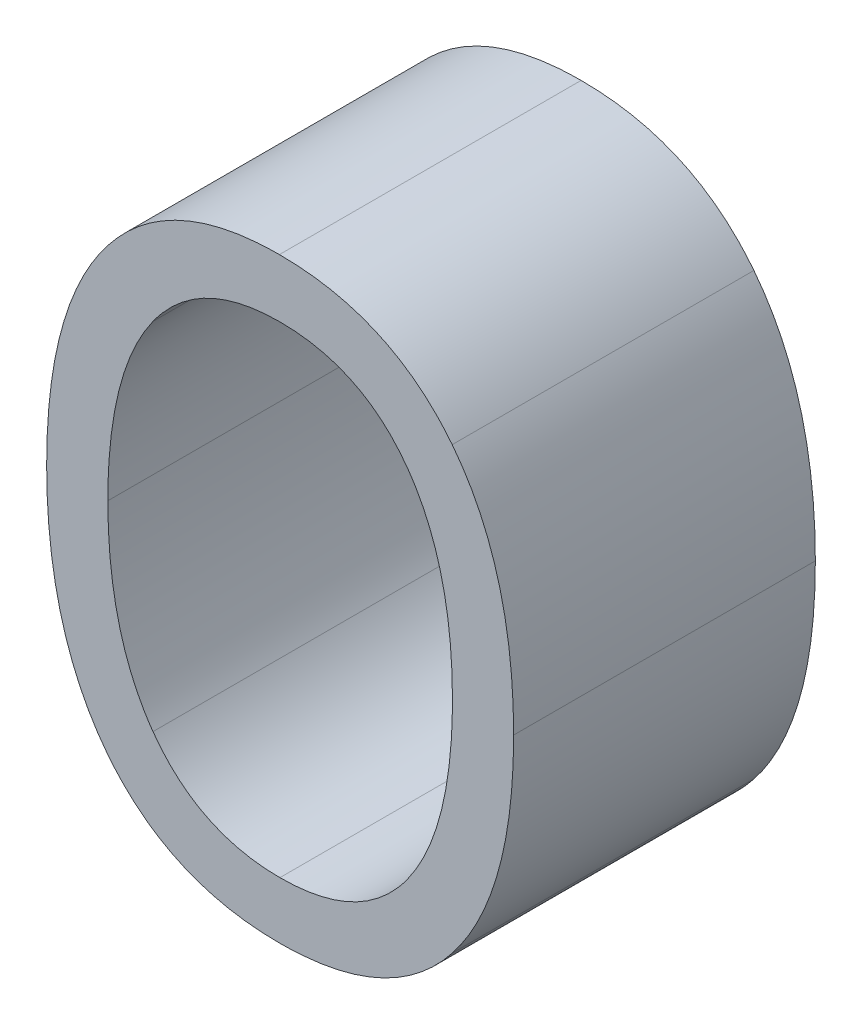
ISO-10303-21;
HEADER;
FILE_DESCRIPTION(('STEP AP214'),'2;1');
FILE_NAME('part.step','',(''),(''),'','','');
FILE_SCHEMA(('AUTOMOTIVE_DESIGN { 1 0 10303 214 1 1 1 1 }'));
ENDSEC;
DATA;
#1=APPLICATION_CONTEXT('core data for automotive mechanical design processes');
#2=APPLICATION_PROTOCOL_DEFINITION('international standard','automotive_design',2000,#1);
#3=PRODUCT_CONTEXT('',#1,'mechanical');
#4=PRODUCT('Part','Part','',(#3));
#5=PRODUCT_RELATED_PRODUCT_CATEGORY('part','',(#4));
#6=PRODUCT_DEFINITION_FORMATION('','',#4);
#7=PRODUCT_DEFINITION_CONTEXT('part definition',#1,'design');
#8=PRODUCT_DEFINITION('design','',#6,#7);
#9=PRODUCT_DEFINITION_SHAPE('','',#8);
#10=(LENGTH_UNIT() NAMED_UNIT(*) SI_UNIT(.MILLI.,.METRE.));
#11=(NAMED_UNIT(*) PLANE_ANGLE_UNIT() SI_UNIT($,.RADIAN.));
#12=(NAMED_UNIT(*) SI_UNIT($,.STERADIAN.) SOLID_ANGLE_UNIT());
#13=UNCERTAINTY_MEASURE_WITH_UNIT(LENGTH_MEASURE(1.E-05),#10,'distance_accuracy_value','');
#14=(GEOMETRIC_REPRESENTATION_CONTEXT(3) GLOBAL_UNCERTAINTY_ASSIGNED_CONTEXT((#13)) GLOBAL_UNIT_ASSIGNED_CONTEXT((#10,
#11,#12)) REPRESENTATION_CONTEXT('',''));
#15=CARTESIAN_POINT('',(0.,0.,0.));
#16=DIRECTION('',(0.,0.,1.));
#17=DIRECTION('',(1.,0.,0.));
#18=AXIS2_PLACEMENT_3D('',#15,#16,#17);
#19=CARTESIAN_POINT('',(21.952691691412,-5.202102016968,19.1980552485228));
#20=CARTESIAN_POINT('',(21.952691691412,-5.202102016968,20.2019447514772));
#21=CARTESIAN_POINT('',(21.952691691412,-5.454750172523,19.1980552485228));
#22=CARTESIAN_POINT('',(21.952691691412,-5.454750172523,20.2019447514772));
#23=CARTESIAN_POINT('',(22.002534958079,-5.650612394746,19.1980552485228));
#24=CARTESIAN_POINT('',(22.002534958079,-5.650612394746,20.2019447514772));
#25=CARTESIAN_POINT('',(22.102342846968,-5.789956794746,19.1980552485228));
#26=CARTESIAN_POINT('',(22.102342846968,-5.789956794746,20.2019447514772));
#27=(BOUNDED_SURFACE() B_SPLINE_SURFACE(3,1,((#19,#20),(#21,#22),(#23,#24),(#25,#26)),
.UNSPECIFIED.,.F.,.F.,.F.) B_SPLINE_SURFACE_WITH_KNOTS((4,4),(2,2),(0.,1.),(-1.00194475147721,
0.00194475147721345),
.UNSPECIFIED.) GEOMETRIC_REPRESENTATION_ITEM() RATIONAL_B_SPLINE_SURFACE(((1.,1.),(1.,1.),(1.,
1.),(1.,1.))) REPRESENTATION_ITEM('') SURFACE());
#28=DIRECTION('',(0.,0.,-1.));
#29=VECTOR('',#28,1.);
#30=CARTESIAN_POINT('',(21.952691691412,-5.202102016968,20.2));
#31=LINE('',#30,#29);
#32=CARTESIAN_POINT('',(21.952691691412,-5.202102016968,20.2));
#33=VERTEX_POINT('',#32);
#34=CARTESIAN_POINT('',(21.952691691412,-5.202102016968,19.2));
#35=VERTEX_POINT('',#34);
#36=EDGE_CURVE('E154',#33,#35,#31,.T.);
#37=CARTESIAN_POINT('',(21.952691691412,-5.202102016968,20.2));
#38=CARTESIAN_POINT('',(21.952691691412,-5.454750172523,20.2));
#39=CARTESIAN_POINT('',(22.002534958079,-5.650612394746,20.2));
#40=CARTESIAN_POINT('',(22.102342846968,-5.789956794746,20.2));
#41=(BOUNDED_CURVE() B_SPLINE_CURVE(3,(#37,#38,#39,#40),.UNSPECIFIED.,.F.,
.F.) B_SPLINE_CURVE_WITH_KNOTS((4,4),(0.,1.),
.UNSPECIFIED.) CURVE() GEOMETRIC_REPRESENTATION_ITEM() RATIONAL_B_SPLINE_CURVE((1.,1.,1.,1.)) REPRESENTATION_ITEM(''));
#42=CARTESIAN_POINT('',(22.102342846968,-5.789956794746,20.2));
#43=VERTEX_POINT('',#42);
#44=EDGE_CURVE('E151',#33,#43,#41,.T.);
#45=DIRECTION('',(0.,0.,-1.));
#46=VECTOR('',#45,1.);
#47=CARTESIAN_POINT('',(22.102342846968,-5.789956794746,20.2));
#48=LINE('',#47,#46);
#49=CARTESIAN_POINT('',(22.102342846968,-5.789956794746,19.2));
#50=VERTEX_POINT('',#49);
#51=EDGE_CURVE('E11',#43,#50,#48,.T.);
#52=CARTESIAN_POINT('',(21.952691691412,-5.202102016968,19.2));
#53=CARTESIAN_POINT('',(21.952691691412,-5.454750172523,19.2));
#54=CARTESIAN_POINT('',(22.002534958079,-5.650612394746,19.2));
#55=CARTESIAN_POINT('',(22.102342846968,-5.789956794746,19.2));
#56=(BOUNDED_CURVE() B_SPLINE_CURVE(3,(#52,#53,#54,#55),.UNSPECIFIED.,.F.,
.F.) B_SPLINE_CURVE_WITH_KNOTS((4,4),(0.,1.),
.UNSPECIFIED.) CURVE() GEOMETRIC_REPRESENTATION_ITEM() RATIONAL_B_SPLINE_CURVE((1.,1.,1.,1.)) REPRESENTATION_ITEM(''));
#57=EDGE_CURVE('E216',#35,#50,#56,.T.);
#58=ORIENTED_EDGE('',*,*,#36,.F.);
#59=ORIENTED_EDGE('',*,*,#44,.T.);
#60=ORIENTED_EDGE('',*,*,#51,.T.);
#61=ORIENTED_EDGE('',*,*,#57,.F.);
#62=EDGE_LOOP('',(#58,#59,#60,#61));
#63=FACE_BOUND('',#62,.T.);
#64=ADVANCED_FACE('F16',(#63),#27,.F.);
#65=CARTESIAN_POINT('',(22.102342846968,-5.789956794746,19.1978705750779));
#66=CARTESIAN_POINT('',(22.102342846968,-5.789956794746,20.2021294249221));
#67=CARTESIAN_POINT('',(22.202164846968,-5.929315305857,19.1978705750779));
#68=CARTESIAN_POINT('',(22.202164846968,-5.929315305857,20.2021294249221));
#69=CARTESIAN_POINT('',(22.342409535857,-5.998829461412,19.1978705750779));
#70=CARTESIAN_POINT('',(22.342409535857,-5.998829461412,20.2021294249221));
#71=CARTESIAN_POINT('',(22.522955558079,-5.998829461412,19.1978705750779));
#72=CARTESIAN_POINT('',(22.522955558079,-5.998829461412,20.2021294249221));
#73=(BOUNDED_SURFACE() B_SPLINE_SURFACE(3,1,((#65,#66),(#67,#68),(#69,#70),(#71,#72)),
.UNSPECIFIED.,.F.,.F.,.F.) B_SPLINE_SURFACE_WITH_KNOTS((4,4),(2,2),(0.,1.),(-1.00212942492215,
0.00212942492214646),
.UNSPECIFIED.) GEOMETRIC_REPRESENTATION_ITEM() RATIONAL_B_SPLINE_SURFACE(((1.,1.),(1.,1.),(1.,
1.),(1.,1.))) REPRESENTATION_ITEM('') SURFACE());
#74=CARTESIAN_POINT('',(22.102342846968,-5.789956794746,20.2));
#75=CARTESIAN_POINT('',(22.202164846968,-5.929315305857,20.2));
#76=CARTESIAN_POINT('',(22.342409535857,-5.998829461412,20.2));
#77=CARTESIAN_POINT('',(22.522955558079,-5.998829461412,20.2));
#78=(BOUNDED_CURVE() B_SPLINE_CURVE(3,(#74,#75,#76,#77),.UNSPECIFIED.,.F.,
.F.) B_SPLINE_CURVE_WITH_KNOTS((4,4),(0.,1.),
.UNSPECIFIED.) CURVE() GEOMETRIC_REPRESENTATION_ITEM() RATIONAL_B_SPLINE_CURVE((1.,1.,1.,1.)) REPRESENTATION_ITEM(''));
#79=CARTESIAN_POINT('',(22.522955558079,-5.998829461412,20.2));
#80=VERTEX_POINT('',#79);
#81=EDGE_CURVE('E142',#43,#80,#78,.T.);
#82=DIRECTION('',(0.,0.,-1.));
#83=VECTOR('',#82,1.);
#84=CARTESIAN_POINT('',(22.522955558079,-5.998829461412,20.2));
#85=LINE('',#84,#83);
#86=CARTESIAN_POINT('',(22.522955558079,-5.998829461412,19.2));
#87=VERTEX_POINT('',#86);
#88=EDGE_CURVE('E29',#80,#87,#85,.T.);
#89=CARTESIAN_POINT('',(22.102342846968,-5.789956794746,19.2));
#90=CARTESIAN_POINT('',(22.202164846968,-5.929315305857,19.2));
#91=CARTESIAN_POINT('',(22.342409535857,-5.998829461412,19.2));
#92=CARTESIAN_POINT('',(22.522955558079,-5.998829461412,19.2));
#93=(BOUNDED_CURVE() B_SPLINE_CURVE(3,(#89,#90,#91,#92),.UNSPECIFIED.,.F.,
.F.) B_SPLINE_CURVE_WITH_KNOTS((4,4),(0.,1.),
.UNSPECIFIED.) CURVE() GEOMETRIC_REPRESENTATION_ITEM() RATIONAL_B_SPLINE_CURVE((1.,1.,1.,1.)) REPRESENTATION_ITEM(''));
#94=EDGE_CURVE('E145',#50,#87,#93,.T.);
#95=ORIENTED_EDGE('',*,*,#51,.F.);
#96=ORIENTED_EDGE('',*,*,#81,.T.);
#97=ORIENTED_EDGE('',*,*,#88,.T.);
#98=ORIENTED_EDGE('',*,*,#94,.F.);
#99=EDGE_LOOP('',(#95,#96,#97,#98));
#100=FACE_BOUND('',#99,.T.);
#101=ADVANCED_FACE('F140',(#100),#73,.F.);
#102=CARTESIAN_POINT('',(22.522955558079,-5.998829461412,19.1978766403374));
#103=CARTESIAN_POINT('',(22.522955558079,-5.998829461412,20.2021233596626));
#104=CARTESIAN_POINT('',(22.705618246968,-5.998829461412,19.1978766403374));
#105=CARTESIAN_POINT('',(22.705618246968,-5.998829461412,20.2021233596626));
#106=CARTESIAN_POINT('',(22.846653158079,-5.929907972523,19.1978766403374));
#107=CARTESIAN_POINT('',(22.846653158079,-5.929907972523,20.2021233596626));
#108=CARTESIAN_POINT('',(22.945944580301,-5.791743261412,19.1978766403374));
#109=CARTESIAN_POINT('',(22.945944580301,-5.791743261412,20.2021233596626));
#110=(BOUNDED_SURFACE() B_SPLINE_SURFACE(3,1,((#102,#103),(#104,#105),(#106,#107),(#108,#109)),
.UNSPECIFIED.,.F.,.F.,.F.) B_SPLINE_SURFACE_WITH_KNOTS((4,4),(2,2),(0.,1.),(-1.00212335966262,
0.00212335966262119),
.UNSPECIFIED.) GEOMETRIC_REPRESENTATION_ITEM() RATIONAL_B_SPLINE_SURFACE(((1.,1.),(1.,1.),(1.,
1.),(1.,1.))) REPRESENTATION_ITEM('') SURFACE());
#111=CARTESIAN_POINT('',(22.522955558079,-5.998829461412,20.2));
#112=CARTESIAN_POINT('',(22.705618246968,-5.998829461412,20.2));
#113=CARTESIAN_POINT('',(22.846653158079,-5.929907972523,20.2));
#114=CARTESIAN_POINT('',(22.945944580301,-5.791743261412,20.2));
#115=(BOUNDED_CURVE() B_SPLINE_CURVE(3,(#111,#112,#113,#114),.UNSPECIFIED.,.F.,
.F.) B_SPLINE_CURVE_WITH_KNOTS((4,4),(0.,1.),
.UNSPECIFIED.) CURVE() GEOMETRIC_REPRESENTATION_ITEM() RATIONAL_B_SPLINE_CURVE((1.,1.,1.,1.)) REPRESENTATION_ITEM(''));
#116=CARTESIAN_POINT('',(22.945944580301,-5.791743261412,20.2));
#117=VERTEX_POINT('',#116);
#118=EDGE_CURVE('E165',#80,#117,#115,.T.);
#119=DIRECTION('',(0.,0.,-1.));
#120=VECTOR('',#119,1.);
#121=CARTESIAN_POINT('',(22.945944580301,-5.791743261412,20.2));
#122=LINE('',#121,#120);
#123=CARTESIAN_POINT('',(22.945944580301,-5.791743261412,19.2));
#124=VERTEX_POINT('',#123);
#125=EDGE_CURVE('E194',#117,#124,#122,.T.);
#126=CARTESIAN_POINT('',(22.522955558079,-5.998829461412,19.2));
#127=CARTESIAN_POINT('',(22.705618246968,-5.998829461412,19.2));
#128=CARTESIAN_POINT('',(22.846653158079,-5.929907972523,19.2));
#129=CARTESIAN_POINT('',(22.945944580301,-5.791743261412,19.2));
#130=(BOUNDED_CURVE() B_SPLINE_CURVE(3,(#126,#127,#128,#129),.UNSPECIFIED.,.F.,
.F.) B_SPLINE_CURVE_WITH_KNOTS((4,4),(0.,1.),
.UNSPECIFIED.) CURVE() GEOMETRIC_REPRESENTATION_ITEM() RATIONAL_B_SPLINE_CURVE((1.,1.,1.,1.)) REPRESENTATION_ITEM(''));
#131=EDGE_CURVE('E215',#87,#124,#130,.T.);
#132=ORIENTED_EDGE('',*,*,#88,.F.);
#133=ORIENTED_EDGE('',*,*,#118,.T.);
#134=ORIENTED_EDGE('',*,*,#125,.T.);
#135=ORIENTED_EDGE('',*,*,#131,.F.);
#136=EDGE_LOOP('',(#132,#133,#134,#135));
#137=FACE_BOUND('',#136,.T.);
#138=ADVANCED_FACE('F446',(#137),#110,.F.);
#139=CARTESIAN_POINT('',(22.945944580301,-5.791743261412,19.1980421734753));
#140=CARTESIAN_POINT('',(22.945944580301,-5.791743261412,20.2019578265248));
#141=CARTESIAN_POINT('',(23.045224713635,-5.653428972523,19.1980421734753));
#142=CARTESIAN_POINT('',(23.045224713635,-5.653428972523,20.2019578265248));
#143=CARTESIAN_POINT('',(23.094932513635,-5.457129305857,19.1980421734753));
#144=CARTESIAN_POINT('',(23.094932513635,-5.457129305857,20.2019578265248));
#145=CARTESIAN_POINT('',(23.094932513635,-5.202102016968,19.1980421734753));
#146=CARTESIAN_POINT('',(23.094932513635,-5.202102016968,20.2019578265248));
#147=(BOUNDED_SURFACE() B_SPLINE_SURFACE(3,1,((#139,#140),(#141,#142),(#143,#144),(#145,#146)),
.UNSPECIFIED.,.F.,.F.,.F.) B_SPLINE_SURFACE_WITH_KNOTS((4,4),(2,2),(0.,1.),(-1.00195782652476,
0.00195782652475572),
.UNSPECIFIED.) GEOMETRIC_REPRESENTATION_ITEM() RATIONAL_B_SPLINE_SURFACE(((1.,1.),(1.,1.),(1.,
1.),(1.,1.))) REPRESENTATION_ITEM('') SURFACE());
#148=CARTESIAN_POINT('',(22.945944580301,-5.791743261412,20.2));
#149=CARTESIAN_POINT('',(23.045224713635,-5.653428972523,20.2));
#150=CARTESIAN_POINT('',(23.094932513635,-5.457129305857,20.2));
#151=CARTESIAN_POINT('',(23.094932513635,-5.202102016968,20.2));
#152=(BOUNDED_CURVE() B_SPLINE_CURVE(3,(#148,#149,#150,#151),.UNSPECIFIED.,.F.,
.F.) B_SPLINE_CURVE_WITH_KNOTS((4,4),(0.,1.),
.UNSPECIFIED.) CURVE() GEOMETRIC_REPRESENTATION_ITEM() RATIONAL_B_SPLINE_CURVE((1.,1.,1.,1.)) REPRESENTATION_ITEM(''));
#153=CARTESIAN_POINT('',(23.094932513635,-5.202102016968,20.2));
#154=VERTEX_POINT('',#153);
#155=EDGE_CURVE('E172',#117,#154,#152,.T.);
#156=DIRECTION('',(0.,0.,-1.));
#157=VECTOR('',#156,1.);
#158=CARTESIAN_POINT('',(23.094932513635,-5.202102016968,20.2));
#159=LINE('',#158,#157);
#160=CARTESIAN_POINT('',(23.094932513635,-5.202102016968,19.2));
#161=VERTEX_POINT('',#160);
#162=EDGE_CURVE('E187',#154,#161,#159,.T.);
#163=CARTESIAN_POINT('',(22.945944580301,-5.791743261412,19.2));
#164=CARTESIAN_POINT('',(23.045224713635,-5.653428972523,19.2));
#165=CARTESIAN_POINT('',(23.094932513635,-5.457129305857,19.2));
#166=CARTESIAN_POINT('',(23.094932513635,-5.202102016968,19.2));
#167=(BOUNDED_CURVE() B_SPLINE_CURVE(3,(#163,#164,#165,#166),.UNSPECIFIED.,.F.,
.F.) B_SPLINE_CURVE_WITH_KNOTS((4,4),(0.,1.),
.UNSPECIFIED.) CURVE() GEOMETRIC_REPRESENTATION_ITEM() RATIONAL_B_SPLINE_CURVE((1.,1.,1.,1.)) REPRESENTATION_ITEM(''));
#168=EDGE_CURVE('E225',#124,#161,#167,.T.);
#169=ORIENTED_EDGE('',*,*,#125,.F.);
#170=ORIENTED_EDGE('',*,*,#155,.T.);
#171=ORIENTED_EDGE('',*,*,#162,.T.);
#172=ORIENTED_EDGE('',*,*,#168,.F.);
#173=EDGE_LOOP('',(#169,#170,#171,#172));
#174=FACE_BOUND('',#173,.T.);
#175=ADVANCED_FACE('F522',(#174),#147,.F.);
#176=CARTESIAN_POINT('',(23.094932513635,-5.202102016968,19.1980464113698));
#177=CARTESIAN_POINT('',(23.094932513635,-5.202102016968,20.2019535886302));
#178=CARTESIAN_POINT('',(23.094932513635,-4.94692232807888,19.1980464113698));
#179=CARTESIAN_POINT('',(23.094932513635,-4.94692232807888,20.2019535886302));
#180=CARTESIAN_POINT('',(23.045224713635,-4.750334794746,19.1980464113698));
#181=CARTESIAN_POINT('',(23.045224713635,-4.750334794746,20.2019535886302));
#182=CARTESIAN_POINT('',(22.945944580301,-4.611566128079,19.1980464113698));
#183=CARTESIAN_POINT('',(22.945944580301,-4.611566128079,20.2019535886302));
#184=(BOUNDED_SURFACE() B_SPLINE_SURFACE(3,1,((#176,#177),(#178,#179),(#180,#181),(#182,#183)),
.UNSPECIFIED.,.F.,.F.,.F.) B_SPLINE_SURFACE_WITH_KNOTS((4,4),(2,2),(0.,1.),(-1.00195358863022,
0.00195358863022238),
.UNSPECIFIED.) GEOMETRIC_REPRESENTATION_ITEM() RATIONAL_B_SPLINE_SURFACE(((1.,1.),(1.,1.),(1.,
1.),(1.,1.))) REPRESENTATION_ITEM('') SURFACE());
#185=CARTESIAN_POINT('',(23.094932513635,-5.202102016968,20.2));
#186=CARTESIAN_POINT('',(23.094932513635,-4.94692232807888,20.2));
#187=CARTESIAN_POINT('',(23.045224713635,-4.750334794746,20.2));
#188=CARTESIAN_POINT('',(22.945944580301,-4.611566128079,20.2));
#189=(BOUNDED_CURVE() B_SPLINE_CURVE(3,(#185,#186,#187,#188),.UNSPECIFIED.,.F.,
.F.) B_SPLINE_CURVE_WITH_KNOTS((4,4),(0.,1.),
.UNSPECIFIED.) CURVE() GEOMETRIC_REPRESENTATION_ITEM() RATIONAL_B_SPLINE_CURVE((1.,1.,1.,1.)) REPRESENTATION_ITEM(''));
#190=CARTESIAN_POINT('',(22.945944580301,-4.611566128079,20.2));
#191=VERTEX_POINT('',#190);
#192=EDGE_CURVE('E319',#154,#191,#189,.T.);
#193=DIRECTION('',(0.,0.,-1.));
#194=VECTOR('',#193,1.);
#195=CARTESIAN_POINT('',(22.945944580301,-4.611566128079,20.2));
#196=LINE('',#195,#194);
#197=CARTESIAN_POINT('',(22.945944580301,-4.611566128079,19.2));
#198=VERTEX_POINT('',#197);
#199=EDGE_CURVE('E182',#191,#198,#196,.T.);
#200=CARTESIAN_POINT('',(23.094932513635,-5.202102016968,19.2));
#201=CARTESIAN_POINT('',(23.094932513635,-4.94692232807888,19.2));
#202=CARTESIAN_POINT('',(23.045224713635,-4.750334794746,19.2));
#203=CARTESIAN_POINT('',(22.945944580301,-4.611566128079,19.2));
#204=(BOUNDED_CURVE() B_SPLINE_CURVE(3,(#200,#201,#202,#203),.UNSPECIFIED.,.F.,
.F.) B_SPLINE_CURVE_WITH_KNOTS((4,4),(0.,1.),
.UNSPECIFIED.) CURVE() GEOMETRIC_REPRESENTATION_ITEM() RATIONAL_B_SPLINE_CURVE((1.,1.,1.,1.)) REPRESENTATION_ITEM(''));
#205=EDGE_CURVE('E380',#161,#198,#204,.T.);
#206=ORIENTED_EDGE('',*,*,#162,.F.);
#207=ORIENTED_EDGE('',*,*,#192,.T.);
#208=ORIENTED_EDGE('',*,*,#199,.T.);
#209=ORIENTED_EDGE('',*,*,#205,.F.);
#210=EDGE_LOOP('',(#206,#207,#208,#209));
#211=FACE_BOUND('',#210,.T.);
#212=ADVANCED_FACE('F511',(#211),#184,.F.);
#213=CARTESIAN_POINT('',(22.9465827394822,-4.61245869891189,20.2));
#214=CARTESIAN_POINT('',(22.8839035348031,-4.52461865395366,20.2));
#215=CARTESIAN_POINT('',(22.7990220422254,-4.4736749415078,20.2));
#216=CARTESIAN_POINT('',(22.6815566715053,-4.4031752143402,20.2));
#217=CARTESIAN_POINT('',(22.5217760451913,-4.40343667145909,20.2));
#218=CARTESIAN_POINT('',(22.9465827394822,-4.61245869891189,19.2));
#219=CARTESIAN_POINT('',(22.8839035348031,-4.52461865395366,19.2));
#220=CARTESIAN_POINT('',(22.7990220422254,-4.4736749415078,19.2));
#221=CARTESIAN_POINT('',(22.6815566715053,-4.4031752143402,19.2));
#222=CARTESIAN_POINT('',(22.5217760451913,-4.40343667145909,19.2));
#223=(BOUNDED_SURFACE() B_SPLINE_SURFACE(1,2,((#213,#214,#215,#216,#217),(#218,#219,#220,#221,
#222)),.UNSPECIFIED.,.F.,.F.,.F.) B_SPLINE_SURFACE_WITH_KNOTS((2,2),(3,2,3),
(-0.0117003646997792,-2.47628151922325E-05),(535.149251645892,538.146587155737,
542.284160374719),
.UNSPECIFIED.) GEOMETRIC_REPRESENTATION_ITEM() RATIONAL_B_SPLINE_SURFACE(((0.987240048111929,
0.9934746460069,1.,0.990992289706126,0.982538630100533),(0.987240048111929,0.9934746460069,1.,
0.990992289706126,0.982538630100533))) REPRESENTATION_ITEM('') SURFACE());
#224=CARTESIAN_POINT('',(-21.2763687638257,-77.9112768646644,20.2));
#225=DIRECTION('',(0.,0.,1.));
#226=DIRECTION('',(-0.514605894124347,-0.857426832874083,0.));
#227=AXIS2_PLACEMENT_3D('',#224,#225,#226);
#228=ELLIPSE('',#227,85.6488263259726,6.24299917260388);
#229=CARTESIAN_POINT('',(22.522955558079,-4.403435705857,20.2));
#230=VERTEX_POINT('',#229);
#231=EDGE_CURVE('E313',#191,#230,#228,.T.);
#232=DIRECTION('',(0.,0.,-1.));
#233=VECTOR('',#232,1.);
#234=CARTESIAN_POINT('',(22.522955558079,-4.403435705857,20.2));
#235=LINE('',#234,#233);
#236=CARTESIAN_POINT('',(22.522955558079,-4.403435705857,19.2));
#237=VERTEX_POINT('',#236);
#238=EDGE_CURVE('E43',#230,#237,#235,.T.);
#239=CARTESIAN_POINT('',(-21.2763687638257,-77.9112768646644,19.2));
#240=DIRECTION('',(0.,0.,1.));
#241=DIRECTION('',(-0.514605894124347,-0.857426832874083,0.));
#242=AXIS2_PLACEMENT_3D('',#239,#240,#241);
#243=ELLIPSE('',#242,85.6488263259726,6.24299917260388);
#244=EDGE_CURVE('E297',#198,#237,#243,.T.);
#245=ORIENTED_EDGE('',*,*,#199,.F.);
#246=ORIENTED_EDGE('',*,*,#231,.T.);
#247=ORIENTED_EDGE('',*,*,#238,.T.);
#248=ORIENTED_EDGE('',*,*,#244,.F.);
#249=EDGE_LOOP('',(#245,#246,#247,#248));
#250=FACE_BOUND('',#249,.T.);
#251=ADVANCED_FACE('F521',(#250),#223,.F.);
#252=CARTESIAN_POINT('',(22.5241226656018,-4.40343667557879,20.2));
#253=CARTESIAN_POINT('',(22.3710446892245,-4.40318242368291,20.2));
#254=CARTESIAN_POINT('',(22.2565181387204,-4.46957286007691,20.2));
#255=CARTESIAN_POINT('',(22.1674042715406,-4.52123169817851,20.2));
#256=CARTESIAN_POINT('',(22.1017000339969,-4.6132064552561,20.2));
#257=CARTESIAN_POINT('',(22.5241226656018,-4.40343667557879,19.2));
#258=CARTESIAN_POINT('',(22.3710446892245,-4.40318242368291,19.2));
#259=CARTESIAN_POINT('',(22.2565181387204,-4.46957286007691,19.2));
#260=CARTESIAN_POINT('',(22.1674042715406,-4.52123169817851,19.2));
#261=CARTESIAN_POINT('',(22.1017000339969,-4.6132064552561,19.2));
#262=(BOUNDED_SURFACE() B_SPLINE_SURFACE(1,2,((#252,#253,#254,#255,#256),(#257,#258,#259,#260,
#261)),.UNSPECIFIED.,.F.,.F.,.F.) B_SPLINE_SURFACE_WITH_KNOTS((2,2),(3,2,3),
(-0.00698793288565868,-1.48468474499607E-05),(895.877339066315,901.062352128046,
905.102889443867),
.UNSPECIFIED.) GEOMETRIC_REPRESENTATION_ITEM() RATIONAL_B_SPLINE_SURFACE(((0.986827106736595,
0.993258379238003,1.,0.994746441342836,0.9896813464451),(0.986827106736595,0.993258379238003,1.,
0.994746441342836,0.9896813464451))) REPRESENTATION_ITEM('') SURFACE());
#263=CARTESIAN_POINT('',(94.1795515900217,-128.540103129819,20.2));
#264=DIRECTION('',(0.,0.,1.));
#265=DIRECTION('',(0.501520458691995,-0.865145785121427,0.));
#266=AXIS2_PLACEMENT_3D('',#263,#264,#265);
#267=ELLIPSE('',#266,143.409969047727,8.07869655368327);
#268=CARTESIAN_POINT('',(22.102342846968,-4.612308372523,20.2));
#269=VERTEX_POINT('',#268);
#270=EDGE_CURVE('E306',#230,#269,#267,.T.);
#271=DIRECTION('',(0.,0.,-1.));
#272=VECTOR('',#271,1.);
#273=CARTESIAN_POINT('',(22.102342846968,-4.612308372523,20.2));
#274=LINE('',#273,#272);
#275=CARTESIAN_POINT('',(22.102342846968,-4.612308372523,19.2));
#276=VERTEX_POINT('',#275);
#277=EDGE_CURVE('E22',#269,#276,#274,.T.);
#278=CARTESIAN_POINT('',(94.1795515900217,-128.540103129819,19.2));
#279=DIRECTION('',(0.,0.,1.));
#280=DIRECTION('',(0.501520458691995,-0.865145785121427,0.));
#281=AXIS2_PLACEMENT_3D('',#278,#279,#280);
#282=ELLIPSE('',#281,143.409969047727,8.07869655368327);
#283=EDGE_CURVE('E293',#237,#276,#282,.T.);
#284=ORIENTED_EDGE('',*,*,#238,.F.);
#285=ORIENTED_EDGE('',*,*,#270,.T.);
#286=ORIENTED_EDGE('',*,*,#277,.T.);
#287=ORIENTED_EDGE('',*,*,#283,.F.);
#288=EDGE_LOOP('',(#284,#285,#286,#287));
#289=FACE_BOUND('',#288,.T.);
#290=ADVANCED_FACE('F559',(#289),#262,.F.);
#291=CARTESIAN_POINT('',(22.102342846968,-4.612308372523,19.19805522249));
#292=CARTESIAN_POINT('',(22.102342846968,-4.612308372523,20.20194477751));
#293=CARTESIAN_POINT('',(22.002534958079,-4.751649950301,19.19805522249));
#294=CARTESIAN_POINT('',(22.002534958079,-4.751649950301,20.20194477751));
#295=CARTESIAN_POINT('',(21.952691691412,-4.94810201696777,19.19805522249));
#296=CARTESIAN_POINT('',(21.952691691412,-4.94810201696777,20.20194477751));
#297=CARTESIAN_POINT('',(21.952691691412,-5.202102016968,19.19805522249));
#298=CARTESIAN_POINT('',(21.952691691412,-5.202102016968,20.20194477751));
#299=(BOUNDED_SURFACE() B_SPLINE_SURFACE(3,1,((#291,#292),(#293,#294),(#295,#296),(#297,#298)),
.UNSPECIFIED.,.F.,.F.,.F.) B_SPLINE_SURFACE_WITH_KNOTS((4,4),(2,2),(0.,1.),(-1.00194477750995,
0.00194477750995188),
.UNSPECIFIED.) GEOMETRIC_REPRESENTATION_ITEM() RATIONAL_B_SPLINE_SURFACE(((1.,1.),(1.,1.),(1.,
1.),(1.,1.))) REPRESENTATION_ITEM('') SURFACE());
#300=CARTESIAN_POINT('',(22.102342846968,-4.612308372523,20.2));
#301=CARTESIAN_POINT('',(22.002534958079,-4.751649950301,20.2));
#302=CARTESIAN_POINT('',(21.952691691412,-4.94810201696777,20.2));
#303=CARTESIAN_POINT('',(21.952691691412,-5.202102016968,20.2));
#304=(BOUNDED_CURVE() B_SPLINE_CURVE(3,(#300,#301,#302,#303),.UNSPECIFIED.,.F.,
.F.) B_SPLINE_CURVE_WITH_KNOTS((4,4),(0.,1.),
.UNSPECIFIED.) CURVE() GEOMETRIC_REPRESENTATION_ITEM() RATIONAL_B_SPLINE_CURVE((1.,1.,1.,1.)) REPRESENTATION_ITEM(''));
#305=EDGE_CURVE('E301',#269,#33,#304,.T.);
#306=CARTESIAN_POINT('',(22.102342846968,-4.612308372523,19.2));
#307=CARTESIAN_POINT('',(22.002534958079,-4.751649950301,19.2));
#308=CARTESIAN_POINT('',(21.952691691412,-4.94810201696777,19.2));
#309=CARTESIAN_POINT('',(21.952691691412,-5.202102016968,19.2));
#310=(BOUNDED_CURVE() B_SPLINE_CURVE(3,(#306,#307,#308,#309),.UNSPECIFIED.,.F.,
.F.) B_SPLINE_CURVE_WITH_KNOTS((4,4),(0.,1.),
.UNSPECIFIED.) CURVE() GEOMETRIC_REPRESENTATION_ITEM() RATIONAL_B_SPLINE_CURVE((1.,1.,1.,1.)) REPRESENTATION_ITEM(''));
#311=EDGE_CURVE('E178',#276,#35,#310,.T.);
#312=ORIENTED_EDGE('',*,*,#277,.F.);
#313=ORIENTED_EDGE('',*,*,#305,.T.);
#314=ORIENTED_EDGE('',*,*,#36,.T.);
#315=ORIENTED_EDGE('',*,*,#311,.F.);
#316=EDGE_LOOP('',(#312,#313,#314,#315));
#317=FACE_BOUND('',#316,.T.);
#318=ADVANCED_FACE('F500',(#317),#299,.F.);
#319=CARTESIAN_POINT('',(23.297751513635,-5.202102016968,19.1984790838637));
#320=CARTESIAN_POINT('',(23.297751513635,-5.202102016968,20.2015209161362));
#321=CARTESIAN_POINT('',(23.297751513635,-5.51452483919,19.1984790838637));
#322=CARTESIAN_POINT('',(23.297751513635,-5.51452483919,20.2015209161362));
#323=CARTESIAN_POINT('',(23.230021002523,-5.756829550301,19.1984790838637));
#324=CARTESIAN_POINT('',(23.230021002523,-5.756829550301,20.2015209161362));
#325=CARTESIAN_POINT('',(23.094808335857,-5.929315305857,19.1984790838637));
#326=CARTESIAN_POINT('',(23.094808335857,-5.929315305857,20.2015209161362));
#327=(BOUNDED_SURFACE() B_SPLINE_SURFACE(3,1,((#319,#320),(#321,#322),(#323,#324),(#325,#326)),
.UNSPECIFIED.,.F.,.F.,.F.) B_SPLINE_SURFACE_WITH_KNOTS((4,4),(2,2),(0.,1.),(-1.00152091613627,
0.00152091613626967),
.UNSPECIFIED.) GEOMETRIC_REPRESENTATION_ITEM() RATIONAL_B_SPLINE_SURFACE(((1.,1.),(1.,1.),(1.,
1.),(1.,1.))) REPRESENTATION_ITEM('') SURFACE());
#328=DIRECTION('',(0.,0.,-1.));
#329=VECTOR('',#328,1.);
#330=CARTESIAN_POINT('',(23.297751513635,-5.202102016968,20.2));
#331=LINE('',#330,#329);
#332=CARTESIAN_POINT('',(23.297751513635,-5.202102016968,20.2));
#333=VERTEX_POINT('',#332);
#334=CARTESIAN_POINT('',(23.297751513635,-5.202102016968,19.2));
#335=VERTEX_POINT('',#334);
#336=EDGE_CURVE('E356',#333,#335,#331,.T.);
#337=CARTESIAN_POINT('',(23.297751513635,-5.202102016968,20.2));
#338=CARTESIAN_POINT('',(23.297751513635,-5.51452483919,20.2));
#339=CARTESIAN_POINT('',(23.230021002523,-5.756829550301,20.2));
#340=CARTESIAN_POINT('',(23.094808335857,-5.929315305857,20.2));
#341=(BOUNDED_CURVE() B_SPLINE_CURVE(3,(#337,#338,#339,#340),.UNSPECIFIED.,.F.,
.F.) B_SPLINE_CURVE_WITH_KNOTS((4,4),(0.,1.),
.UNSPECIFIED.) CURVE() GEOMETRIC_REPRESENTATION_ITEM() RATIONAL_B_SPLINE_CURVE((1.,1.,1.,1.)) REPRESENTATION_ITEM(''));
#342=CARTESIAN_POINT('',(23.094808335857,-5.929315305857,20.2));
#343=VERTEX_POINT('',#342);
#344=EDGE_CURVE('E350',#333,#343,#341,.T.);
#345=DIRECTION('',(0.,0.,-1.));
#346=VECTOR('',#345,1.);
#347=CARTESIAN_POINT('',(23.094808335857,-5.929315305857,20.2));
#348=LINE('',#347,#346);
#349=CARTESIAN_POINT('',(23.094808335857,-5.929315305857,19.2));
#350=VERTEX_POINT('',#349);
#351=EDGE_CURVE('E291',#343,#350,#348,.T.);
#352=CARTESIAN_POINT('',(23.297751513635,-5.202102016968,19.2));
#353=CARTESIAN_POINT('',(23.297751513635,-5.51452483919,19.2));
#354=CARTESIAN_POINT('',(23.230021002523,-5.756829550301,19.2));
#355=CARTESIAN_POINT('',(23.094808335857,-5.929315305857,19.2));
#356=(BOUNDED_CURVE() B_SPLINE_CURVE(3,(#352,#353,#354,#355),.UNSPECIFIED.,.F.,
.F.) B_SPLINE_CURVE_WITH_KNOTS((4,4),(0.,1.),
.UNSPECIFIED.) CURVE() GEOMETRIC_REPRESENTATION_ITEM() RATIONAL_B_SPLINE_CURVE((1.,1.,1.,1.)) REPRESENTATION_ITEM(''));
#357=EDGE_CURVE('E240',#335,#350,#356,.T.);
#358=ORIENTED_EDGE('',*,*,#336,.F.);
#359=ORIENTED_EDGE('',*,*,#344,.T.);
#360=ORIENTED_EDGE('',*,*,#351,.T.);
#361=ORIENTED_EDGE('',*,*,#357,.F.);
#362=EDGE_LOOP('',(#358,#359,#360,#361));
#363=FACE_BOUND('',#362,.T.);
#364=ADVANCED_FACE('F490',(#363),#327,.F.);
#365=CARTESIAN_POINT('',(23.0935279740925,-4.46951026382933,20.2));
#366=CARTESIAN_POINT('',(23.2979678143929,-4.72976501022865,20.2));
#367=CARTESIAN_POINT('',(23.2977512847412,-5.20310226592358,20.2));
#368=CARTESIAN_POINT('',(23.0935279740925,-4.46951026382933,19.2));
#369=CARTESIAN_POINT('',(23.2979678143929,-4.72976501022865,19.2));
#370=CARTESIAN_POINT('',(23.2977512847412,-5.20310226592358,19.2));
#371=(BOUNDED_SURFACE() B_SPLINE_SURFACE(1,2,((#365,#366,#367),(#368,#369,#370)),.UNSPECIFIED.,
.F.,.F.,.F.) B_SPLINE_SURFACE_WITH_KNOTS((2,2),(3,3),(-0.00587790864217722,
-8.9058132285505E-06),(537.050939144982,548.027464097783),
.UNSPECIFIED.) GEOMETRIC_REPRESENTATION_ITEM() RATIONAL_B_SPLINE_SURFACE(((0.996161691966016,
0.984308061869195,0.973439707840594),(0.996161691966016,0.984308061869195,0.973439707840594))) REPRESENTATION_ITEM('') SURFACE());
#372=DIRECTION('',(0.,0.,-1.));
#373=VECTOR('',#372,1.);
#374=CARTESIAN_POINT('',(23.094145113635,-4.470296972523,20.2));
#375=LINE('',#374,#373);
#376=CARTESIAN_POINT('',(23.094145113635,-4.470296972523,20.2));
#377=VERTEX_POINT('',#376);
#378=CARTESIAN_POINT('',(23.094145113635,-4.470296972523,19.2));
#379=VERTEX_POINT('',#378);
#380=EDGE_CURVE('E275',#377,#379,#375,.T.);
#381=CARTESIAN_POINT('',(-94.6899344599987,-127.575524407011,20.2));
#382=DIRECTION('',(0.,0.,-1.));
#383=DIRECTION('',(0.6908733567441,0.722975798309417,0.));
#384=AXIS2_PLACEMENT_3D('',#381,#382,#383);
#385=ELLIPSE('',#384,170.383566335448,11.1200390558028);
#386=EDGE_CURVE('E344',#377,#333,#385,.T.);
#387=CARTESIAN_POINT('',(-94.6899344599987,-127.575524407011,19.2));
#388=DIRECTION('',(0.,0.,-1.));
#389=DIRECTION('',(0.6908733567441,0.722975798309417,0.));
#390=AXIS2_PLACEMENT_3D('',#387,#388,#389);
#391=ELLIPSE('',#390,170.383566335448,11.1200390558028);
#392=EDGE_CURVE('E241',#379,#335,#391,.T.);
#393=ORIENTED_EDGE('',*,*,#380,.F.);
#394=ORIENTED_EDGE('',*,*,#386,.T.);
#395=ORIENTED_EDGE('',*,*,#336,.T.);
#396=ORIENTED_EDGE('',*,*,#392,.F.);
#397=EDGE_LOOP('',(#393,#394,#395,#396));
#398=FACE_BOUND('',#397,.T.);
#399=ADVANCED_FACE('F18',(#398),#371,.F.);
#400=CARTESIAN_POINT('',(23.094808335857,-5.929315305857,19.1984095418532));
#401=CARTESIAN_POINT('',(23.094808335857,-5.929315305857,20.2015904581468));
#402=CARTESIAN_POINT('',(22.959601313635,-6.101197105857,19.1984095418532));
#403=CARTESIAN_POINT('',(22.959601313635,-6.101197105857,20.2015904581468));
#404=CARTESIAN_POINT('',(22.768576380301,-6.187297461412,19.1984095418532));
#405=CARTESIAN_POINT('',(22.768576380301,-6.187297461412,20.2015904581468));
#406=CARTESIAN_POINT('',(22.521366646968,-6.187297461412,19.1984095418532));
#407=CARTESIAN_POINT('',(22.521366646968,-6.187297461412,20.2015904581468));
#408=(BOUNDED_SURFACE() B_SPLINE_SURFACE(3,1,((#400,#401),(#402,#403),(#404,#405),(#406,#407)),
.UNSPECIFIED.,.F.,.F.,.F.) B_SPLINE_SURFACE_WITH_KNOTS((4,4),(2,2),(0.,1.),(-1.00159045814677,
0.00159045814677162),
.UNSPECIFIED.) GEOMETRIC_REPRESENTATION_ITEM() RATIONAL_B_SPLINE_SURFACE(((1.,1.),(1.,1.),(1.,
1.),(1.,1.))) REPRESENTATION_ITEM('') SURFACE());
#409=CARTESIAN_POINT('',(23.094808335857,-5.929315305857,20.2));
#410=CARTESIAN_POINT('',(22.959601313635,-6.101197105857,20.2));
#411=CARTESIAN_POINT('',(22.768576380301,-6.187297461412,20.2));
#412=CARTESIAN_POINT('',(22.521366646968,-6.187297461412,20.2));
#413=(BOUNDED_CURVE() B_SPLINE_CURVE(3,(#409,#410,#411,#412),.UNSPECIFIED.,.F.,
.F.) B_SPLINE_CURVE_WITH_KNOTS((4,4),(0.,1.),
.UNSPECIFIED.) CURVE() GEOMETRIC_REPRESENTATION_ITEM() RATIONAL_B_SPLINE_CURVE((1.,1.,1.,1.)) REPRESENTATION_ITEM(''));
#414=CARTESIAN_POINT('',(22.521366646968,-6.187297461412,20.2));
#415=VERTEX_POINT('',#414);
#416=EDGE_CURVE('E232',#343,#415,#413,.T.);
#417=DIRECTION('',(0.,0.,-1.));
#418=VECTOR('',#417,1.);
#419=CARTESIAN_POINT('',(22.521366646968,-6.187297461412,20.2));
#420=LINE('',#419,#418);
#421=CARTESIAN_POINT('',(22.521366646968,-6.187297461412,19.2));
#422=VERTEX_POINT('',#421);
#423=EDGE_CURVE('E292',#415,#422,#420,.T.);
#424=CARTESIAN_POINT('',(23.094808335857,-5.929315305857,19.2));
#425=CARTESIAN_POINT('',(22.959601313635,-6.101197105857,19.2));
#426=CARTESIAN_POINT('',(22.768576380301,-6.187297461412,19.2));
#427=CARTESIAN_POINT('',(22.521366646968,-6.187297461412,19.2));
#428=(BOUNDED_CURVE() B_SPLINE_CURVE(3,(#424,#425,#426,#427),.UNSPECIFIED.,.F.,
.F.) B_SPLINE_CURVE_WITH_KNOTS((4,4),(0.,1.),
.UNSPECIFIED.) CURVE() GEOMETRIC_REPRESENTATION_ITEM() RATIONAL_B_SPLINE_CURVE((1.,1.,1.,1.)) REPRESENTATION_ITEM(''));
#429=EDGE_CURVE('E233',#350,#422,#428,.T.);
#430=ORIENTED_EDGE('',*,*,#351,.F.);
#431=ORIENTED_EDGE('',*,*,#416,.T.);
#432=ORIENTED_EDGE('',*,*,#423,.T.);
#433=ORIENTED_EDGE('',*,*,#429,.F.);
#434=EDGE_LOOP('',(#430,#431,#432,#433));
#435=FACE_BOUND('',#434,.T.);
#436=ADVANCED_FACE('F560',(#435),#408,.F.);
#437=CARTESIAN_POINT('',(22.521366646968,-4.211132305857,19.1984092837697));
#438=CARTESIAN_POINT('',(22.521366646968,-4.211132305857,20.2015907162303));
#439=CARTESIAN_POINT('',(22.76739386919,-4.211132305857,19.1984092837697));
#440=CARTESIAN_POINT('',(22.76739386919,-4.211132305857,20.2015907162303));
#441=CARTESIAN_POINT('',(22.958269224746,-4.297520528079,19.1984092837697));
#442=CARTESIAN_POINT('',(22.958269224746,-4.297520528079,20.2015907162303));
#443=CARTESIAN_POINT('',(23.094145113635,-4.470296972523,19.1984092837697));
#444=CARTESIAN_POINT('',(23.094145113635,-4.470296972523,20.2015907162303));
#445=(BOUNDED_SURFACE() B_SPLINE_SURFACE(3,1,((#437,#438),(#439,#440),(#441,#442),(#443,#444)),
.UNSPECIFIED.,.F.,.F.,.F.) B_SPLINE_SURFACE_WITH_KNOTS((4,4),(2,2),(0.,1.),(-1.00159071623028,
0.00159071623027667),
.UNSPECIFIED.) GEOMETRIC_REPRESENTATION_ITEM() RATIONAL_B_SPLINE_SURFACE(((1.,1.),(1.,1.),(1.,
1.),(1.,1.))) REPRESENTATION_ITEM('') SURFACE());
#446=DIRECTION('',(0.,0.,-1.));
#447=VECTOR('',#446,1.);
#448=CARTESIAN_POINT('',(22.521366646968,-4.211132305857,20.2));
#449=LINE('',#448,#447);
#450=CARTESIAN_POINT('',(22.521366646968,-4.211132305857,20.2));
#451=VERTEX_POINT('',#450);
#452=CARTESIAN_POINT('',(22.521366646968,-4.211132305857,19.2));
#453=VERTEX_POINT('',#452);
#454=EDGE_CURVE('E188',#451,#453,#449,.T.);
#455=CARTESIAN_POINT('',(22.521366646968,-4.211132305857,20.2));
#456=CARTESIAN_POINT('',(22.76739386919,-4.211132305857,20.2));
#457=CARTESIAN_POINT('',(22.958269224746,-4.297520528079,20.2));
#458=CARTESIAN_POINT('',(23.094145113635,-4.470296972523,20.2));
#459=(BOUNDED_CURVE() B_SPLINE_CURVE(3,(#455,#456,#457,#458),.UNSPECIFIED.,.F.,
.F.) B_SPLINE_CURVE_WITH_KNOTS((4,4),(0.,1.),
.UNSPECIFIED.) CURVE() GEOMETRIC_REPRESENTATION_ITEM() RATIONAL_B_SPLINE_CURVE((1.,1.,1.,1.)) REPRESENTATION_ITEM(''));
#460=EDGE_CURVE('E272',#451,#377,#459,.T.);
#461=CARTESIAN_POINT('',(22.521366646968,-4.211132305857,19.2));
#462=CARTESIAN_POINT('',(22.76739386919,-4.211132305857,19.2));
#463=CARTESIAN_POINT('',(22.958269224746,-4.297520528079,19.2));
#464=CARTESIAN_POINT('',(23.094145113635,-4.470296972523,19.2));
#465=(BOUNDED_CURVE() B_SPLINE_CURVE(3,(#461,#462,#463,#464),.UNSPECIFIED.,.F.,
.F.) B_SPLINE_CURVE_WITH_KNOTS((4,4),(0.,1.),
.UNSPECIFIED.) CURVE() GEOMETRIC_REPRESENTATION_ITEM() RATIONAL_B_SPLINE_CURVE((1.,1.,1.,1.)) REPRESENTATION_ITEM(''));
#466=EDGE_CURVE('E159',#453,#379,#465,.T.);
#467=ORIENTED_EDGE('',*,*,#454,.F.);
#468=ORIENTED_EDGE('',*,*,#460,.T.);
#469=ORIENTED_EDGE('',*,*,#380,.T.);
#470=ORIENTED_EDGE('',*,*,#466,.F.);
#471=EDGE_LOOP('',(#467,#468,#469,#470));
#472=FACE_BOUND('',#471,.T.);
#473=ADVANCED_FACE('F271',(#472),#445,.F.);
#474=CARTESIAN_POINT('',(22.5223669760393,-6.18729698337395,20.2));
#475=CARTESIAN_POINT('',(22.2828262726965,-6.18752583243551,20.2));
#476=CARTESIAN_POINT('',(22.113253961119,-6.07831565513058,20.2));
#477=CARTESIAN_POINT('',(22.0219795343086,-6.01953190533889,20.2));
#478=CARTESIAN_POINT('',(21.9511542739367,-5.92912096975155,20.2));
#479=CARTESIAN_POINT('',(22.5223669760393,-6.18729698337395,19.2));
#480=CARTESIAN_POINT('',(22.2828262726965,-6.18752583243551,19.2));
#481=CARTESIAN_POINT('',(22.113253961119,-6.07831565513058,19.2));
#482=CARTESIAN_POINT('',(22.0219795343086,-6.01953190533889,19.2));
#483=CARTESIAN_POINT('',(21.9511542739367,-5.92912096975155,19.2));
#484=(BOUNDED_SURFACE() B_SPLINE_SURFACE(1,2,((#474,#475,#476,#477,#478),(#479,#480,#481,#482,
#483)),.UNSPECIFIED.,.F.,.F.,.F.) B_SPLINE_SURFACE_WITH_KNOTS((2,2),(3,2,3),
(-0.0165193794105365,-2.63786004962505E-05),(376.609149046637,380.960710518771,
383.317556468413),
.UNSPECIFIED.) GEOMETRIC_REPRESENTATION_ITEM() RATIONAL_B_SPLINE_SURFACE(((0.974458080428112,
0.986617592720232,1.,0.992751964416509,0.985862653558927),(0.974458080428112,0.986617592720232,
1.,0.992751964416509,0.985862653558927))) REPRESENTATION_ITEM('') SURFACE());
#485=CARTESIAN_POINT('',(54.9435870059584,44.8978411602231,20.2));
#486=DIRECTION('',(0.,0.,-1.));
#487=DIRECTION('',(0.541456970990588,0.840728463040058,0.));
#488=AXIS2_PLACEMENT_3D('',#485,#486,#487);
#489=ELLIPSE('',#488,60.6333186587295,6.15947377252891);
#490=CARTESIAN_POINT('',(21.951771646968,-5.929907972523,20.2));
#491=VERTEX_POINT('',#490);
#492=EDGE_CURVE('E226',#415,#491,#489,.T.);
#493=DIRECTION('',(0.,0.,-1.));
#494=VECTOR('',#493,1.);
#495=CARTESIAN_POINT('',(21.951771646968,-5.929907972523,20.2));
#496=LINE('',#495,#494);
#497=CARTESIAN_POINT('',(21.951771646968,-5.929907972523,19.2));
#498=VERTEX_POINT('',#497);
#499=EDGE_CURVE('E206',#491,#498,#496,.T.);
#500=CARTESIAN_POINT('',(54.9435870059584,44.8978411602231,19.2));
#501=DIRECTION('',(0.,0.,-1.));
#502=DIRECTION('',(0.541456970990588,0.840728463040058,0.));
#503=AXIS2_PLACEMENT_3D('',#500,#501,#502);
#504=ELLIPSE('',#503,60.6333186587295,6.15947377252891);
#505=EDGE_CURVE('E239',#422,#498,#504,.T.);
#506=ORIENTED_EDGE('',*,*,#423,.F.);
#507=ORIENTED_EDGE('',*,*,#492,.T.);
#508=ORIENTED_EDGE('',*,*,#499,.T.);
#509=ORIENTED_EDGE('',*,*,#505,.F.);
#510=EDGE_LOOP('',(#506,#507,#508,#509));
#511=FACE_BOUND('',#510,.T.);
#512=ADVANCED_FACE('F450',(#511),#484,.F.);
#513=CARTESIAN_POINT('',(22.52337700234,-5.199599885325,19.2));
#514=DIRECTION('',(0.,0.,-1.));
#515=DIRECTION('',(0.,-1.,0.));
#516=AXIS2_PLACEMENT_3D('',#513,#514,#515);
#517=PLANE('',#516);
#518=ORIENTED_EDGE('',*,*,#311,.T.);
#519=ORIENTED_EDGE('',*,*,#57,.T.);
#520=ORIENTED_EDGE('',*,*,#94,.T.);
#521=ORIENTED_EDGE('',*,*,#131,.T.);
#522=ORIENTED_EDGE('',*,*,#168,.T.);
#523=ORIENTED_EDGE('',*,*,#205,.T.);
#524=ORIENTED_EDGE('',*,*,#244,.T.);
#525=ORIENTED_EDGE('',*,*,#283,.T.);
#526=EDGE_LOOP('',(#518,#519,#520,#521,#522,#523,#524,#525));
#527=FACE_BOUND('',#526,.T.);
#528=CARTESIAN_POINT('',(21.749883980301,-5.202102016968,19.2));
#529=CARTESIAN_POINT('',(21.749883980301,-4.887012194746,19.2));
#530=CARTESIAN_POINT('',(21.817227846968,-4.643222994746,19.2));
#531=CARTESIAN_POINT('',(21.951771646968,-4.470296972523,19.2));
#532=(BOUNDED_CURVE() B_SPLINE_CURVE(3,(#528,#529,#530,#531),.UNSPECIFIED.,.F.,
.F.) B_SPLINE_CURVE_WITH_KNOTS((4,4),(0.,1.),
.UNSPECIFIED.) CURVE() GEOMETRIC_REPRESENTATION_ITEM() RATIONAL_B_SPLINE_CURVE((1.,1.,1.,1.)) REPRESENTATION_ITEM(''));
#533=CARTESIAN_POINT('',(21.749883980301,-5.202102016968,19.2));
#534=VERTEX_POINT('',#533);
#535=CARTESIAN_POINT('',(21.951771646968,-4.470296972523,19.2));
#536=VERTEX_POINT('',#535);
#537=EDGE_CURVE('E201',#534,#536,#532,.T.);
#538=ORIENTED_EDGE('',*,*,#537,.T.);
#539=CARTESIAN_POINT('',(70.1167430760766,-79.2888484873634,19.2));
#540=DIRECTION('',(0.,0.,-1.));
#541=DIRECTION('',(-0.539210274970159,0.8421711698738,0.));
#542=AXIS2_PLACEMENT_3D('',#539,#540,#541);
#543=ELLIPSE('',#542,89.0199157212632,7.45562034322487);
#544=EDGE_CURVE('E192',#536,#453,#543,.T.);
#545=ORIENTED_EDGE('',*,*,#544,.T.);
#546=ORIENTED_EDGE('',*,*,#466,.T.);
#547=ORIENTED_EDGE('',*,*,#392,.T.);
#548=ORIENTED_EDGE('',*,*,#357,.T.);
#549=ORIENTED_EDGE('',*,*,#429,.T.);
#550=ORIENTED_EDGE('',*,*,#505,.T.);
#551=CARTESIAN_POINT('',(104.760276917082,81.8206162951766,19.2));
#552=DIRECTION('',(0.,0.,-1.));
#553=DIRECTION('',(0.68567909149188,0.72790396584362,0.));
#554=AXIS2_PLACEMENT_3D('',#551,#552,#553);
#555=ELLIPSE('',#554,120.662190982975,9.27248991921459);
#556=EDGE_CURVE('E99',#498,#534,#555,.T.);
#557=ORIENTED_EDGE('',*,*,#556,.T.);
#558=EDGE_LOOP('',(#538,#545,#546,#547,#548,#549,#550,#557));
#559=FACE_BOUND('',#558,.T.);
#560=ADVANCED_FACE('F260',(#527,#559),#517,.T.);
#561=CARTESIAN_POINT('',(22.52337700234,-5.199599885325,20.2));
#562=DIRECTION('',(0.,0.,-1.));
#563=DIRECTION('',(0.,-1.,0.));
#564=AXIS2_PLACEMENT_3D('',#561,#562,#563);
#565=PLANE('',#564);
#566=ORIENTED_EDGE('',*,*,#305,.F.);
#567=ORIENTED_EDGE('',*,*,#270,.F.);
#568=ORIENTED_EDGE('',*,*,#231,.F.);
#569=ORIENTED_EDGE('',*,*,#192,.F.);
#570=ORIENTED_EDGE('',*,*,#155,.F.);
#571=ORIENTED_EDGE('',*,*,#118,.F.);
#572=ORIENTED_EDGE('',*,*,#81,.F.);
#573=ORIENTED_EDGE('',*,*,#44,.F.);
#574=EDGE_LOOP('',(#566,#567,#568,#569,#570,#571,#572,#573));
#575=FACE_BOUND('',#574,.T.);
#576=CARTESIAN_POINT('',(21.749883980301,-5.202102016968,20.2));
#577=CARTESIAN_POINT('',(21.749883980301,-4.887012194746,20.2));
#578=CARTESIAN_POINT('',(21.817227846968,-4.643222994746,20.2));
#579=CARTESIAN_POINT('',(21.951771646968,-4.470296972523,20.2));
#580=(BOUNDED_CURVE() B_SPLINE_CURVE(3,(#576,#577,#578,#579),.UNSPECIFIED.,.F.,
.F.) B_SPLINE_CURVE_WITH_KNOTS((4,4),(0.,1.),
.UNSPECIFIED.) CURVE() GEOMETRIC_REPRESENTATION_ITEM() RATIONAL_B_SPLINE_CURVE((1.,1.,1.,1.)) REPRESENTATION_ITEM(''));
#581=CARTESIAN_POINT('',(21.749883980301,-5.202102016968,20.2));
#582=VERTEX_POINT('',#581);
#583=CARTESIAN_POINT('',(21.951771646968,-4.470296972523,20.2));
#584=VERTEX_POINT('',#583);
#585=EDGE_CURVE('E200',#582,#584,#580,.T.);
#586=ORIENTED_EDGE('',*,*,#585,.F.);
#587=CARTESIAN_POINT('',(104.760276917082,81.8206162951766,20.2));
#588=DIRECTION('',(0.,0.,-1.));
#589=DIRECTION('',(0.68567909149188,0.72790396584362,0.));
#590=AXIS2_PLACEMENT_3D('',#587,#588,#589);
#591=ELLIPSE('',#590,120.662190982975,9.27248991921459);
#592=EDGE_CURVE('E87',#491,#582,#591,.T.);
#593=ORIENTED_EDGE('',*,*,#592,.F.);
#594=ORIENTED_EDGE('',*,*,#492,.F.);
#595=ORIENTED_EDGE('',*,*,#416,.F.);
#596=ORIENTED_EDGE('',*,*,#344,.F.);
#597=ORIENTED_EDGE('',*,*,#386,.F.);
#598=ORIENTED_EDGE('',*,*,#460,.F.);
#599=CARTESIAN_POINT('',(70.1167430760766,-79.2888484873634,20.2));
#600=DIRECTION('',(0.,0.,-1.));
#601=DIRECTION('',(-0.539210274970159,0.8421711698738,0.));
#602=AXIS2_PLACEMENT_3D('',#599,#600,#601);
#603=ELLIPSE('',#602,89.0199157212632,7.45562034322487);
#604=EDGE_CURVE('E193',#584,#451,#603,.T.);
#605=ORIENTED_EDGE('',*,*,#604,.F.);
#606=EDGE_LOOP('',(#586,#593,#594,#595,#596,#597,#598,#605));
#607=FACE_BOUND('',#606,.T.);
#608=ADVANCED_FACE('F161',(#575,#607),#565,.F.);
#609=CARTESIAN_POINT('',(21.9511572386115,-4.47108629114628,20.2));
#610=CARTESIAN_POINT('',(22.0231413404163,-4.37848138905947,20.2));
#611=CARTESIAN_POINT('',(22.1162897848319,-4.31884195805618,20.2));
#612=CARTESIAN_POINT('',(22.2848725591915,-4.21090477453323,20.2));
#613=CARTESIAN_POINT('',(22.5223669731701,-4.21113278615943,20.2));
#614=CARTESIAN_POINT('',(21.9511572386115,-4.47108629114628,19.2));
#615=CARTESIAN_POINT('',(22.0231413404163,-4.37848138905947,19.2));
#616=CARTESIAN_POINT('',(22.1162897848319,-4.31884195805618,19.2));
#617=CARTESIAN_POINT('',(22.2848725591915,-4.21090477453323,19.2));
#618=CARTESIAN_POINT('',(22.5223669731701,-4.21113278615943,19.2));
#619=(BOUNDED_SURFACE() B_SPLINE_SURFACE(1,2,((#609,#610,#611,#612,#613),(#614,#615,#616,#617,
#618)),.UNSPECIFIED.,.F.,.F.,.F.) B_SPLINE_SURFACE_WITH_KNOTS((2,2),(3,2,3),(-0.011251625069163,
-1.79472410742308E-05),(276.742688090882,279.658425465483,284.909440628095),
.UNSPECIFIED.) GEOMETRIC_REPRESENTATION_ITEM() RATIONAL_B_SPLINE_SURFACE(((0.988039809809587,
0.993892551576517,1.,0.98900096265324,0.978828020379937),(0.988039809809587,0.993892551576517,
1.,0.98900096265324,0.978828020379937))) REPRESENTATION_ITEM('') SURFACE());
#620=DIRECTION('',(0.,0.,-1.));
#621=VECTOR('',#620,1.);
#622=CARTESIAN_POINT('',(21.951771646968,-4.470296972523,20.2));
#623=LINE('',#622,#621);
#624=EDGE_CURVE('E207',#584,#536,#623,.T.);
#625=ORIENTED_EDGE('',*,*,#624,.F.);
#626=ORIENTED_EDGE('',*,*,#604,.T.);
#627=ORIENTED_EDGE('',*,*,#454,.T.);
#628=ORIENTED_EDGE('',*,*,#544,.F.);
#629=EDGE_LOOP('',(#625,#626,#627,#628));
#630=FACE_BOUND('',#629,.T.);
#631=ADVANCED_FACE('F268',(#630),#619,.F.);
#632=CARTESIAN_POINT('',(21.9523890939281,-5.93069442786049,20.2));
#633=CARTESIAN_POINT('',(21.749668744698,-5.67284561126072,20.2));
#634=CARTESIAN_POINT('',(21.7498842087876,-5.2011017638223,20.2));
#635=CARTESIAN_POINT('',(21.9523890939281,-5.93069442786049,19.2));
#636=CARTESIAN_POINT('',(21.749668744698,-5.67284561126072,19.2));
#637=CARTESIAN_POINT('',(21.7498842087876,-5.2011017638223,19.2));
#638=(BOUNDED_SURFACE() B_SPLINE_SURFACE(1,2,((#632,#633,#634),(#635,#636,#637)),.UNSPECIFIED.,
.F.,.F.,.F.) B_SPLINE_SURFACE_WITH_KNOTS((2,2),(3,3),(-0.00830034953674461,
-1.26685205586348E-05),(1.54219915465735,10.743769324462),
.UNSPECIFIED.) GEOMETRIC_REPRESENTATION_ITEM() RATIONAL_B_SPLINE_SURFACE(((0.995272356706428,
0.981284256447565,0.968676824946162),(0.995272356706428,0.981284256447565,0.968676824946162))) REPRESENTATION_ITEM('') SURFACE());
#639=DIRECTION('',(0.,0.,-1.));
#640=VECTOR('',#639,1.);
#641=CARTESIAN_POINT('',(21.749883980301,-5.202102016968,20.2));
#642=LINE('',#641,#640);
#643=EDGE_CURVE('E197',#582,#534,#642,.T.);
#644=ORIENTED_EDGE('',*,*,#499,.F.);
#645=ORIENTED_EDGE('',*,*,#592,.T.);
#646=ORIENTED_EDGE('',*,*,#643,.T.);
#647=ORIENTED_EDGE('',*,*,#556,.F.);
#648=EDGE_LOOP('',(#644,#645,#646,#647));
#649=FACE_BOUND('',#648,.T.);
#650=ADVANCED_FACE('F480',(#649),#638,.F.);
#651=CARTESIAN_POINT('',(21.749883980301,-5.202102016968,19.1984786347116));
#652=CARTESIAN_POINT('',(21.749883980301,-5.202102016968,20.2015213652884));
#653=CARTESIAN_POINT('',(21.749883980301,-4.887012194746,19.1984786347116));
#654=CARTESIAN_POINT('',(21.749883980301,-4.887012194746,20.2015213652884));
#655=CARTESIAN_POINT('',(21.817227846968,-4.643222994746,19.1984786347116));
#656=CARTESIAN_POINT('',(21.817227846968,-4.643222994746,20.2015213652884));
#657=CARTESIAN_POINT('',(21.951771646968,-4.470296972523,19.1984786347116));
#658=CARTESIAN_POINT('',(21.951771646968,-4.470296972523,20.2015213652884));
#659=(BOUNDED_SURFACE() B_SPLINE_SURFACE(3,1,((#651,#652),(#653,#654),(#655,#656),(#657,#658)),
.UNSPECIFIED.,.F.,.F.,.F.) B_SPLINE_SURFACE_WITH_KNOTS((4,4),(2,2),(0.,1.),(-1.00152136528839,
0.00152136528838633),
.UNSPECIFIED.) GEOMETRIC_REPRESENTATION_ITEM() RATIONAL_B_SPLINE_SURFACE(((1.,1.),(1.,1.),(1.,
1.),(1.,1.))) REPRESENTATION_ITEM('') SURFACE());
#660=ORIENTED_EDGE('',*,*,#643,.F.);
#661=ORIENTED_EDGE('',*,*,#585,.T.);
#662=ORIENTED_EDGE('',*,*,#624,.T.);
#663=ORIENTED_EDGE('',*,*,#537,.F.);
#664=EDGE_LOOP('',(#660,#661,#662,#663));
#665=FACE_BOUND('',#664,.T.);
#666=ADVANCED_FACE('F340',(#665),#659,.F.);
#667=CLOSED_SHELL('',(#64,#101,#138,#175,#212,#251,#290,#318,#364,#399,#436,#473,#512,#560,#608,
#631,#650,#666));
#668=MANIFOLD_SOLID_BREP('B1',#667);
#669=ADVANCED_BREP_SHAPE_REPRESENTATION('',(#18,#668),#14);
#670=SHAPE_DEFINITION_REPRESENTATION(#9,#669);
ENDSEC;
END-ISO-10303-21;
